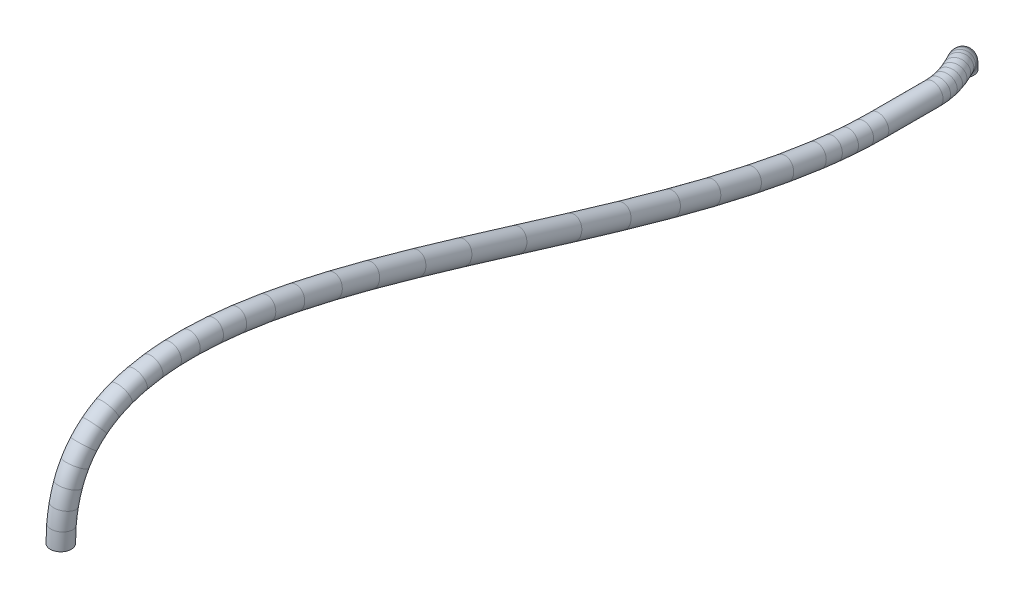
ISO-10303-21;
HEADER;
FILE_DESCRIPTION(('STEP AP214'),'2;1');
FILE_NAME('part.step','',(''),(''),'','','');
FILE_SCHEMA(('AUTOMOTIVE_DESIGN { 1 0 10303 214 1 1 1 1 }'));
ENDSEC;
DATA;
#1=APPLICATION_CONTEXT('core data for automotive mechanical design processes');
#2=APPLICATION_PROTOCOL_DEFINITION('international standard','automotive_design',2000,#1);
#3=PRODUCT_CONTEXT('',#1,'mechanical');
#4=PRODUCT('Part','Part','',(#3));
#5=PRODUCT_RELATED_PRODUCT_CATEGORY('part','',(#4));
#6=PRODUCT_DEFINITION_FORMATION('','',#4);
#7=PRODUCT_DEFINITION_CONTEXT('part definition',#1,'design');
#8=PRODUCT_DEFINITION('design','',#6,#7);
#9=PRODUCT_DEFINITION_SHAPE('','',#8);
#10=(LENGTH_UNIT() NAMED_UNIT(*) SI_UNIT(.MILLI.,.METRE.));
#11=(NAMED_UNIT(*) PLANE_ANGLE_UNIT() SI_UNIT($,.RADIAN.));
#12=(NAMED_UNIT(*) SI_UNIT($,.STERADIAN.) SOLID_ANGLE_UNIT());
#13=UNCERTAINTY_MEASURE_WITH_UNIT(LENGTH_MEASURE(1.E-05),#10,'distance_accuracy_value','');
#14=(GEOMETRIC_REPRESENTATION_CONTEXT(3) GLOBAL_UNCERTAINTY_ASSIGNED_CONTEXT((#13)) GLOBAL_UNIT_ASSIGNED_CONTEXT((#10,
#11,#12)) REPRESENTATION_CONTEXT('',''));
#15=CARTESIAN_POINT('',(0.,0.,0.));
#16=DIRECTION('',(0.,0.,1.));
#17=DIRECTION('',(1.,0.,0.));
#18=AXIS2_PLACEMENT_3D('',#15,#16,#17);
#19=CARTESIAN_POINT('',(-3.74968353162594,128.049999999714,224.960489149716));
#20=DIRECTION('',(0.,1.,0.));
#21=DIRECTION('',(0.,0.,-1.));
#22=AXIS2_PLACEMENT_3D('',#19,#20,#21);
#23=PLANE('',#22);
#24=CARTESIAN_POINT('',(-3.74968353162594,128.049999999714,224.960489149716));
#25=DIRECTION('',(0.,-1.,0.));
#26=DIRECTION('',(0.,0.,-1.));
#27=AXIS2_PLACEMENT_3D('',#24,#25,#26);
#28=CIRCLE('',#27,0.77);
#29=CARTESIAN_POINT('',(-3.74968353162594,128.049999999714,224.190489149716));
#30=VERTEX_POINT('',#29);
#31=EDGE_CURVE('E11',#30,#30,#28,.T.);
#32=ORIENTED_EDGE('',*,*,#31,.T.);
#33=EDGE_LOOP('',(#32));
#34=FACE_BOUND('',#33,.T.);
#35=ADVANCED_FACE('F43',(#34),#23,.F.);
#36=CARTESIAN_POINT('',(-3.57489488065331,128.049999999715,211.014651433645));
#37=DIRECTION('',(-0.999921466294672,0.,-0.0125324077140817));
#38=DIRECTION('',(-0.0125324077140817,0.,0.999921466294672));
#39=AXIS2_PLACEMENT_3D('',#36,#37,#38);
#40=TOROIDAL_SURFACE('',#39,13.9469330203994,0.77);
#41=ORIENTED_EDGE('',*,*,#31,.F.);
#42=EDGE_LOOP('',(#41));
#43=FACE_BOUND('',#42,.T.);
#44=CARTESIAN_POINT('',(-3.74904137688921,129.244421709112,224.909253639303));
#45=DIRECTION('',(-0.00107328111656013,-0.996326107369345,0.0856337307484272));
#46=DIRECTION('',(-4.60391044399756E-05,-0.0856337307484272,-0.996326684395488));
#47=AXIS2_PLACEMENT_3D('',#44,#45,#46);
#48=CIRCLE('',#47,0.77);
#49=CARTESIAN_POINT('',(-3.74907682699963,129.178483736436,224.142082092318));
#50=VERTEX_POINT('',#49);
#51=EDGE_CURVE('E52',#50,#50,#48,.T.);
#52=ORIENTED_EDGE('',*,*,#51,.T.);
#53=EDGE_LOOP('',(#52));
#54=FACE_BOUND('',#53,.T.);
#55=ADVANCED_FACE('F295',(#43,#54),#40,.T.);
#56=CARTESIAN_POINT('',(-3.62396192345315,128.373826335564,214.781671357992));
#57=DIRECTION('',(0.999923726127993,-1.56135381442176E-05,0.0123507765961815));
#58=DIRECTION('',(0.0123507765976869,0.,-0.999923726249874));
#59=AXIS2_PLACEMENT_3D('',#56,#57,#58);
#60=TOROIDAL_SURFACE('',#59,10.1657023386898,0.77);
#61=CARTESIAN_POINT('',(-3.74689794232879,130.426519028251,224.7372147125));
#62=DIRECTION('',(-0.0025092009655732,-0.979401327154709,0.201907761807487));
#63=DIRECTION('',(-0.000256872652281758,-0.201907759491489,-0.979404508195448));
#64=AXIS2_PLACEMENT_3D('',#61,#62,#63);
#65=CIRCLE('',#64,0.77);
#66=CARTESIAN_POINT('',(-3.74709573427105,130.271050053443,223.983073241189));
#67=VERTEX_POINT('',#66);
#68=EDGE_CURVE('E167',#67,#67,#65,.T.);
#69=ORIENTED_EDGE('',*,*,#68,.T.);
#70=EDGE_LOOP('',(#69));
#71=FACE_BOUND('',#70,.T.);
#72=ORIENTED_EDGE('',*,*,#51,.F.);
#73=EDGE_LOOP('',(#72));
#74=FACE_BOUND('',#73,.T.);
#75=ADVANCED_FACE('F168',(#71,#74),#60,.T.);
#76=CARTESIAN_POINT('',(-3.64297806845377,128.677711002938,216.255499449286));
#77=DIRECTION('',(0.999924861807434,-3.46504543539627E-05,0.0122584476476254));
#78=DIRECTION('',(0.0122584476549845,0.,-0.999924862407716));
#79=AXIS2_PLACEMENT_3D('',#76,#77,#78);
#80=TOROIDAL_SURFACE('',#79,8.66075185280262,0.77);
#81=CARTESIAN_POINT('',(-3.74293003548531,131.574581719271,224.416796669273));
#82=DIRECTION('',(-0.00413288953237224,-0.942401928786135,0.334457058296406));
#83=DIRECTION('',(-0.000714986324046932,-0.334457044428597,-0.942410724804553));
#84=AXIS2_PLACEMENT_3D('',#81,#82,#83);
#85=CIRCLE('',#84,0.77);
#86=CARTESIAN_POINT('',(-3.74348057495483,131.317049795061,223.691140411173));
#87=VERTEX_POINT('',#86);
#88=EDGE_CURVE('E171',#87,#87,#85,.T.);
#89=ORIENTED_EDGE('',*,*,#88,.T.);
#90=EDGE_LOOP('',(#89));
#91=FACE_BOUND('',#90,.T.);
#92=ORIENTED_EDGE('',*,*,#68,.F.);
#93=EDGE_LOOP('',(#92));
#94=FACE_BOUND('',#93,.T.);
#95=ADVANCED_FACE('F309',(#91,#94),#80,.T.);
#96=CARTESIAN_POINT('',(-3.66728173386011,129.341525842741,218.125634719291));
#97=DIRECTION('',(0.999927259751701,-0.000104786281678555,0.0120608550811929));
#98=DIRECTION('',(0.012060855147408,0.,-0.999927265241384));
#99=AXIS2_PLACEMENT_3D('',#96,#97,#98);
#100=TOROIDAL_SURFACE('',#99,6.67615008025848,0.77);
#101=CARTESIAN_POINT('',(-3.73682959366278,132.656122237585,223.920424942294));
#102=DIRECTION('',(-0.00607896479311895,-0.868046320935459,0.496445999981325));
#103=DIRECTION('',(-0.00162868645288827,-0.496445919935974,-0.868066124186034));
#104=AXIS2_PLACEMENT_3D('',#101,#102,#103);
#105=CIRCLE('',#104,0.77);
#106=CARTESIAN_POINT('',(-3.7380836822315,132.273858879235,223.252014026671));
#107=VERTEX_POINT('',#106);
#108=EDGE_CURVE('E173',#107,#107,#105,.T.);
#109=ORIENTED_EDGE('',*,*,#108,.T.);
#110=EDGE_LOOP('',(#109));
#111=FACE_BOUND('',#110,.T.);
#112=ORIENTED_EDGE('',*,*,#88,.F.);
#113=EDGE_LOOP('',(#112));
#114=FACE_BOUND('',#113,.T.);
#115=ADVANCED_FACE('F312',(#111,#114),#100,.T.);
#116=CARTESIAN_POINT('',(-3.6737908037922,129.618432694617,218.609732497533));
#117=DIRECTION('',(0.999928443325836,-0.000161505477799532,0.0119616948611179));
#118=DIRECTION('',(0.0119616950171224,0.,-0.999928456366913));
#119=AXIS2_PLACEMENT_3D('',#116,#117,#118);
#120=TOROIDAL_SURFACE('',#119,6.1184136744201,0.77);
#121=CARTESIAN_POINT('',(-3.72911386483873,133.561643425338,223.287660926162));
#122=DIRECTION('',(-0.00783258490682145,-0.764619016978677,0.644434953651833));
#123=DIRECTION('',(-0.00288966355690719,-0.644434724493458,-0.764653866603426));
#124=AXIS2_PLACEMENT_3D('',#121,#122,#123);
#125=CIRCLE('',#124,0.77);
#126=CARTESIAN_POINT('',(-3.73133890577755,133.065428687478,222.698877448877));
#127=VERTEX_POINT('',#126);
#128=EDGE_CURVE('E205',#127,#127,#125,.T.);
#129=ORIENTED_EDGE('',*,*,#128,.T.);
#130=EDGE_LOOP('',(#129));
#131=FACE_BOUND('',#130,.T.);
#132=ORIENTED_EDGE('',*,*,#108,.F.);
#133=EDGE_LOOP('',(#132));
#134=FACE_BOUND('',#133,.T.);
#135=ADVANCED_FACE('F381',(#131,#134),#120,.T.);
#136=CARTESIAN_POINT('',(-3.676303124242,129.698910660878,218.705188687702));
#137=DIRECTION('',(0.999930503616955,-0.000310253225086737,0.011785231405404));
#138=DIRECTION('',(0.0117852319726099,0.,-0.999930551742146));
#139=AXIS2_PLACEMENT_3D('',#136,#137,#138);
#140=TOROIDAL_SURFACE('',#139,5.99354195782575,0.77);
#141=CARTESIAN_POINT('',(-3.71960252022102,134.337006732867,222.501072667689));
#142=DIRECTION('',(-0.00931648116066649,-0.633370134036581,0.773792915765754));
#143=DIRECTION('',(-0.0044764870964178,-0.773792328230094,-0.63342355011124));
#144=AXIS2_PLACEMENT_3D('',#141,#142,#143);
#145=CIRCLE('',#144,0.77);
#146=CARTESIAN_POINT('',(-3.72304941528527,133.74118664013,222.013336534103));
#147=VERTEX_POINT('',#146);
#148=EDGE_CURVE('E186',#147,#147,#145,.T.);
#149=ORIENTED_EDGE('',*,*,#148,.T.);
#150=EDGE_LOOP('',(#149));
#151=FACE_BOUND('',#150,.T.);
#152=ORIENTED_EDGE('',*,*,#128,.F.);
#153=EDGE_LOOP('',(#152));
#154=FACE_BOUND('',#153,.T.);
#155=ADVANCED_FACE('F384',(#151,#154),#140,.T.);
#156=CARTESIAN_POINT('',(-3.67427278205336,129.387492829691,218.450309334562));
#157=DIRECTION('',(0.999931484793308,-0.000416360646926431,0.0116983914647522));
#158=DIRECTION('',(0.0116983924787466,0.,-0.999931571465474));
#159=AXIS2_PLACEMENT_3D('',#156,#157,#158);
#160=TOROIDAL_SURFACE('',#159,6.39596953118865,0.77);
#161=CARTESIAN_POINT('',(-3.7084524315179,134.970619210377,221.570558974054));
#162=DIRECTION('',(-0.0104148005759103,-0.487875323146402,0.87285119063547));
#163=DIRECTION('',(-0.0062196697506987,-0.872850040660919,-0.487948893047647));
#164=AXIS2_PLACEMENT_3D('',#161,#162,#163);
#165=CIRCLE('',#164,0.77);
#166=CARTESIAN_POINT('',(-3.71324157722594,134.298524679068,221.194838326407));
#167=VERTEX_POINT('',#166);
#168=EDGE_CURVE('E184',#167,#167,#165,.T.);
#169=ORIENTED_EDGE('',*,*,#168,.T.);
#170=EDGE_LOOP('',(#169));
#171=FACE_BOUND('',#170,.T.);
#172=ORIENTED_EDGE('',*,*,#148,.F.);
#173=EDGE_LOOP('',(#172));
#174=FACE_BOUND('',#173,.T.);
#175=ADVANCED_FACE('F359',(#171,#174),#160,.T.);
#176=CARTESIAN_POINT('',(-3.66806613831771,127.989365269457,217.668907760488));
#177=DIRECTION('',(0.999933013635121,-0.000673159565455074,0.0115548733781388));
#178=DIRECTION('',(0.0115548759961493,0.,-0.999933240191921));
#179=AXIS2_PLACEMENT_3D('',#176,#177,#178);
#180=TOROIDAL_SURFACE('',#179,7.99765089464495,0.77);
#181=CARTESIAN_POINT('',(-3.69633890299015,135.449911800551,220.550203639215));
#182=DIRECTION('',(-0.011021391598779,-0.360284488203109,0.932777367053602));
#183=DIRECTION('',(-0.00773420938151877,-0.932775406000503,-0.360375115630698));
#184=AXIS2_PLACEMENT_3D('',#181,#182,#183);
#185=CIRCLE('',#184,0.77);
#186=CARTESIAN_POINT('',(-3.70229424421392,134.731674737931,220.272714800179));
#187=VERTEX_POINT('',#186);
#188=EDGE_CURVE('E187',#187,#187,#185,.T.);
#189=ORIENTED_EDGE('',*,*,#188,.T.);
#190=EDGE_LOOP('',(#189));
#191=FACE_BOUND('',#190,.T.);
#192=ORIENTED_EDGE('',*,*,#168,.F.);
#193=EDGE_LOOP('',(#192));
#194=FACE_BOUND('',#193,.T.);
#195=ADVANCED_FACE('F356',(#191,#194),#180,.T.);
#196=CARTESIAN_POINT('',(-3.66499366198673,126.759352754111,217.193852744941));
#197=DIRECTION('',(0.99993360202921,-0.000832261267531237,0.0114934274292904));
#198=DIRECTION('',(0.0114934314098044,0.,-0.999933948335803));
#199=AXIS2_PLACEMENT_3D('',#196,#197,#198);
#200=TOROIDAL_SURFACE('',#199,9.31621652760905,0.77);
#201=CARTESIAN_POINT('',(-3.68322899083849,135.801932792062,219.435125624205));
#202=DIRECTION('',(-0.0113560651723383,-0.240584108696933,0.970561861205304));
#203=DIRECTION('',(-0.00914133689401931,-0.970558910298777,-0.240690335492395));
#204=AXIS2_PLACEMENT_3D('',#201,#202,#203);
#205=CIRCLE('',#204,0.77);
#206=CARTESIAN_POINT('',(-3.69026782024688,135.054602431132,219.249794065876));
#207=VERTEX_POINT('',#206);
#208=EDGE_CURVE('E214',#207,#207,#205,.T.);
#209=ORIENTED_EDGE('',*,*,#208,.T.);
#210=EDGE_LOOP('',(#209));
#211=FACE_BOUND('',#210,.T.);
#212=ORIENTED_EDGE('',*,*,#188,.F.);
#213=EDGE_LOOP('',(#212));
#214=FACE_BOUND('',#213,.T.);
#215=ADVANCED_FACE('F358',(#211,#214),#200,.T.);
#216=CARTESIAN_POINT('',(-3.66317642336996,123.386435817015,216.357791066875));
#217=DIRECTION('',(0.999934288916584,-0.00121053123396785,0.0113996694257865));
#218=DIRECTION('',(0.0113996777782529,0.,-0.999935021562177));
#219=AXIS2_PLACEMENT_3D('',#216,#217,#218);
#220=TOROIDAL_SURFACE('',#219,12.791206167543,0.77);
#221=CARTESIAN_POINT('',(-3.66986690857346,136.031256444592,218.287408063689));
#222=DIRECTION('',(-0.0114518236066517,-0.150851017772034,0.988490175051439));
#223=DIRECTION('',(-0.0101859073416778,-0.988486109490566,-0.150968402773002));
#224=AXIS2_PLACEMENT_3D('',#221,#222,#223);
#225=CIRCLE('',#224,0.77);
#226=CARTESIAN_POINT('',(-3.67771005722656,135.270122140285,218.171162393554));
#227=VERTEX_POINT('',#226);
#228=EDGE_CURVE('E253',#227,#227,#225,.T.);
#229=ORIENTED_EDGE('',*,*,#228,.T.);
#230=EDGE_LOOP('',(#229));
#231=FACE_BOUND('',#230,.T.);
#232=ORIENTED_EDGE('',*,*,#208,.F.);
#233=EDGE_LOOP('',(#232));
#234=FACE_BOUND('',#233,.T.);
#235=ADVANCED_FACE('F396',(#231,#234),#220,.T.);
#236=CARTESIAN_POINT('',(-3.66548148912358,121.04671640111,216.000705623541));
#237=DIRECTION('',(0.99993438386414,-0.00144161136022933,0.0113644059646101));
#238=DIRECTION('',(0.0113644177736289,0.,-0.999935422919233));
#239=AXIS2_PLACEMENT_3D('',#236,#237,#238);
#240=TOROIDAL_SURFACE('',#239,15.1580166115629,0.77);
#241=CARTESIAN_POINT('',(-3.65422136859531,136.176266224485,216.929179073955));
#242=DIRECTION('',(-0.0114313665546635,-0.0612405030805032,0.998057575814712));
#243=DIRECTION('',(-0.0112180134444045,-0.998052125044577,-0.0613686554225046));
#244=AXIS2_PLACEMENT_3D('',#241,#242,#243);
#245=CIRCLE('',#244,0.77);
#246=CARTESIAN_POINT('',(-3.6628592389475,135.4077660882,216.88192520928));
#247=VERTEX_POINT('',#246);
#248=EDGE_CURVE('E249',#247,#247,#245,.T.);
#249=ORIENTED_EDGE('',*,*,#248,.T.);
#250=EDGE_LOOP('',(#249));
#251=FACE_BOUND('',#250,.T.);
#252=ORIENTED_EDGE('',*,*,#228,.F.);
#253=EDGE_LOOP('',(#252));
#254=FACE_BOUND('',#253,.T.);
#255=ADVANCED_FACE('F354',(#251,#254),#240,.T.);
#256=CARTESIAN_POINT('',(-3.68281952873534,114.77656851712,215.61577271225));
#257=DIRECTION('',(0.999933770131024,-0.00203156120989126,0.0113281997954771));
#258=DIRECTION('',(0.0113282231726545,0.,-0.999935833621213));
#259=AXIS2_PLACEMENT_3D('',#256,#257,#258);
#260=TOROIDAL_SURFACE('',#259,21.4399840506549,0.77);
#261=CARTESIAN_POINT('',(-3.63866380234682,136.216442461495,215.56312659716));
#262=DIRECTION('',(-0.0113231530981067,0.00247867876726917,0.999932818921094));
#263=DIRECTION('',(-0.011943611286467,-0.999925926538434,0.00234341325684274));
#264=AXIS2_PLACEMENT_3D('',#261,#262,#263);
#265=CIRCLE('',#264,0.77);
#266=CARTESIAN_POINT('',(-3.6478603830374,135.446499498061,215.564931025368));
#267=VERTEX_POINT('',#266);
#268=EDGE_CURVE('E243',#267,#267,#265,.T.);
#269=ORIENTED_EDGE('',*,*,#268,.T.);
#270=EDGE_LOOP('',(#269));
#271=FACE_BOUND('',#270,.T.);
#272=ORIENTED_EDGE('',*,*,#248,.F.);
#273=EDGE_LOOP('',(#272));
#274=FACE_BOUND('',#273,.T.);
#275=ADVANCED_FACE('F351',(#271,#274),#260,.T.);
#276=CARTESIAN_POINT('',(-3.70077807656531,110.657380501893,215.625780181042));
#277=DIRECTION('',(0.999932937891432,-0.00240229079995971,0.0113291093525691));
#278=DIRECTION('',(0.0113291420428618,0.,-0.999935823210956));
#279=AXIS2_PLACEMENT_3D('',#276,#277,#278);
#280=TOROIDAL_SURFACE('',#279,25.5592142271515,0.77);
#281=CARTESIAN_POINT('',(-3.61965239461575,136.156251354112,213.872373270188));
#282=DIRECTION('',(-0.0111375608198057,0.0686331117157715,0.997579796665508));
#283=DIRECTION('',(-0.0126873957821717,-0.997571066073339,0.0684908615916703));
#284=AXIS2_PLACEMENT_3D('',#281,#282,#283);
#285=CIRCLE('',#284,0.77);
#286=CARTESIAN_POINT('',(-3.62942168936802,135.388121633235,213.925111233614));
#287=VERTEX_POINT('',#286);
#288=EDGE_CURVE('E219',#287,#287,#285,.T.);
#289=ORIENTED_EDGE('',*,*,#288,.T.);
#290=EDGE_LOOP('',(#289));
#291=FACE_BOUND('',#290,.T.);
#292=ORIENTED_EDGE('',*,*,#268,.F.);
#293=EDGE_LOOP('',(#292));
#294=FACE_BOUND('',#293,.T.);
#295=ADVANCED_FACE('F353',(#291,#294),#280,.T.);
#296=CARTESIAN_POINT('',(-3.77324801372848,99.4965880502139,216.392829372891));
#297=DIRECTION('',(0.999929239218928,-0.00340582268664042,0.0113981106716906));
#298=DIRECTION('',(0.0113981767791885,0.,-0.999935038673068));
#299=AXIS2_PLACEMENT_3D('',#296,#297,#298);
#300=TOROIDAL_SURFACE('',#299,36.7465264227112,0.77);
#301=CARTESIAN_POINT('',(-3.60097097834687,136.001245847421,212.187180330605));
#302=DIRECTION('',(-0.0109332901309623,0.114495586102504,0.993363591002789));
#303=DIRECTION('',(-0.0131957632904346,-0.993352983136307,0.114349126474064));
#304=AXIS2_PLACEMENT_3D('',#301,#302,#303);
#305=CIRCLE('',#304,0.77);
#306=CARTESIAN_POINT('',(-3.61113171608051,135.236364050406,212.275229157991));
#307=VERTEX_POINT('',#306);
#308=EDGE_CURVE('E216',#307,#307,#305,.T.);
#309=ORIENTED_EDGE('',*,*,#308,.T.);
#310=EDGE_LOOP('',(#309));
#311=FACE_BOUND('',#310,.T.);
#312=ORIENTED_EDGE('',*,*,#288,.F.);
#313=EDGE_LOOP('',(#312));
#314=FACE_BOUND('',#313,.T.);
#315=ADVANCED_FACE('F291',(#311,#314),#300,.T.);
#316=CARTESIAN_POINT('',(-3.83695933223886,92.2051185638422,217.232546577784));
#317=DIRECTION('',(0.999925902291017,-0.00406610011188762,0.0114741778518016));
#318=DIRECTION('',(0.011474272705245,0.,-0.999934168366041));
#319=AXIS2_PLACEMENT_3D('',#316,#317,#318);
#320=TOROIDAL_SURFACE('',#319,44.0864171385112,0.77);
#321=CARTESIAN_POINT('',(-3.5779174970338,135.705597552396,210.073398499639));
#322=DIRECTION('',(-0.0106613884787951,0.162444361746452,0.986660105675958));
#323=DIRECTION('',(-0.0137186629416297,-0.986647080967109,0.162293979882735));
#324=AXIS2_PLACEMENT_3D('',#321,#322,#323);
#325=CIRCLE('',#324,0.77);
#326=CARTESIAN_POINT('',(-3.58848086749885,134.945879300052,210.198364864149));
#327=VERTEX_POINT('',#326);
#328=EDGE_CURVE('E220',#327,#327,#325,.T.);
#329=ORIENTED_EDGE('',*,*,#328,.T.);
#330=EDGE_LOOP('',(#329));
#331=FACE_BOUND('',#330,.T.);
#332=ORIENTED_EDGE('',*,*,#308,.F.);
#333=EDGE_LOOP('',(#332));
#334=FACE_BOUND('',#333,.T.);
#335=ADVANCED_FACE('F276',(#331,#334),#320,.T.);
#336=CARTESIAN_POINT('',(-4.08426599900101,71.8011531395204,220.589196440206));
#337=DIRECTION('',(0.999912601927666,-0.00598279508960853,0.0117896000424699));
#338=DIRECTION('',(0.011789811045646,0.,-0.999930497762474));
#339=AXIS2_PLACEMENT_3D('',#336,#337,#338);
#340=TOROIDAL_SURFACE('',#339,64.7658583734563,0.77);
#341=CARTESIAN_POINT('',(-3.55543554196876,135.324139513465,207.973057913148));
#342=DIRECTION('',(-0.0103979295285411,0.194875369792719,0.980772895888579));
#343=DIRECTION('',(-0.0140657835414622,-0.980757382188605,0.194723165072674));
#344=AXIS2_PLACEMENT_3D('',#341,#342,#343);
#345=CIRCLE('',#344,0.77);
#346=CARTESIAN_POINT('',(-3.56626619529569,134.56895632918,208.122994750253));
#347=VERTEX_POINT('',#346);
#348=EDGE_CURVE('E182',#347,#347,#345,.T.);
#349=ORIENTED_EDGE('',*,*,#348,.T.);
#350=EDGE_LOOP('',(#349));
#351=FACE_BOUND('',#350,.T.);
#352=ORIENTED_EDGE('',*,*,#328,.F.);
#353=EDGE_LOOP('',(#352));
#354=FACE_BOUND('',#353,.T.);
#355=ADVANCED_FACE('F279',(#351,#354),#340,.T.);
#356=CARTESIAN_POINT('',(-4.31591775887795,57.5750148695578,223.413413207446));
#357=DIRECTION('',(0.999899919531076,-0.00738368115377129,0.0120678156418905));
#358=DIRECTION('',(0.0120681446164382,0.,-0.999927177291185));
#359=AXIS2_PLACEMENT_3D('',#356,#357,#358);
#360=TOROIDAL_SURFACE('',#359,79.2711125676326,0.77);
#361=CARTESIAN_POINT('',(-3.52680457670898,134.730170501625,205.23736997776));
#362=DIRECTION('',(-0.0100526920883623,0.229386802407344,0.973283431618514));
#363=DIRECTION('',(-0.0144269577185918,-0.973264576160402,0.229233347666301));
#364=AXIS2_PLACEMENT_3D('',#361,#362,#363);
#365=CIRCLE('',#364,0.77);
#366=CARTESIAN_POINT('',(-3.5379133341523,133.980756777982,205.413879655463));
#367=VERTEX_POINT('',#366);
#368=EDGE_CURVE('E179',#367,#367,#365,.T.);
#369=ORIENTED_EDGE('',*,*,#368,.T.);
#370=EDGE_LOOP('',(#369));
#371=FACE_BOUND('',#370,.T.);
#372=ORIENTED_EDGE('',*,*,#348,.F.);
#373=EDGE_LOOP('',(#372));
#374=FACE_BOUND('',#373,.T.);
#375=ADVANCED_FACE('F281',(#371,#374),#360,.T.);
#376=CARTESIAN_POINT('',(-5.3916457097763,12.5276460749525,234.019221944709));
#377=DIRECTION('',(0.999839165076537,-0.0121510282503366,0.0131907729687246));
#378=DIRECTION('',(0.0131917468688151,0.,-0.99991298512148));
#379=AXIS2_PLACEMENT_3D('',#376,#377,#378);
#380=TOROIDAL_SURFACE('',#379,125.560063759742,0.77);
#381=CARTESIAN_POINT('',(-3.499124076831,134.057583464795,202.519661769361));
#382=DIRECTION('',(-0.00971902793698738,0.251030915605625,0.967930276366104));
#383=DIRECTION('',(-0.0146474139412622,-0.967907881078682,0.250878032140339));
#384=AXIS2_PLACEMENT_3D('',#381,#382,#383);
#385=CIRCLE('',#384,0.77);
#386=CARTESIAN_POINT('',(-3.51040258556577,133.312294396364,202.712837854109));
#387=VERTEX_POINT('',#386);
#388=EDGE_CURVE('E183',#387,#387,#385,.T.);
#389=ORIENTED_EDGE('',*,*,#388,.T.);
#390=EDGE_LOOP('',(#389));
#391=FACE_BOUND('',#390,.T.);
#392=ORIENTED_EDGE('',*,*,#368,.F.);
#393=EDGE_LOOP('',(#392));
#394=FACE_BOUND('',#393,.T.);
#395=ADVANCED_FACE('F288',(#391,#394),#380,.T.);
#396=CARTESIAN_POINT('',(-6.63767229498544,-23.3288101017454,243.306015711337));
#397=DIRECTION('',(0.999766490161775,-0.0162437742654542,0.0142514892982556));
#398=DIRECTION('',(-0.0162454241122349,-0.999868034390246,0.));
#399=AXIS2_PLACEMENT_3D('',#396,#397,#398);
#400=TOROIDAL_SURFACE('',#399,162.615663552684,0.77);
#401=CARTESIAN_POINT('',(-3.46593820794016,133.145546053802,199.152080425026));
#402=DIRECTION('',(-0.00930270812436144,0.271737825723932,0.962326355085624));
#403=DIRECTION('',(-0.0148514872069349,-0.962299395928268,0.271586645334106));
#404=AXIS2_PLACEMENT_3D('',#401,#402,#403);
#405=CIRCLE('',#404,0.77);
#406=CARTESIAN_POINT('',(-3.4773738530895,132.404575518937,199.361202141933));
#407=VERTEX_POINT('',#406);
#408=EDGE_CURVE('E202',#407,#407,#405,.T.);
#409=ORIENTED_EDGE('',*,*,#408,.T.);
#410=EDGE_LOOP('',(#409));
#411=FACE_BOUND('',#410,.T.);
#412=ORIENTED_EDGE('',*,*,#388,.F.);
#413=EDGE_LOOP('',(#412));
#414=FACE_BOUND('',#413,.T.);
#415=ADVANCED_FACE('F341',(#411,#414),#400,.T.);
#416=CARTESIAN_POINT('',(-16.9990722425859,-186.818386888551,289.371378891754));
#417=DIRECTION('',(0.999129131083776,-0.0366199012053915,0.0199990563649066));
#418=DIRECTION('',(-0.0366272266920443,-0.99932899801059,0.));
#419=AXIS2_PLACEMENT_3D('',#416,#417,#418);
#420=TOROIDAL_SURFACE('',#419,332.71547291427,0.77);
#421=CARTESIAN_POINT('',(-3.43422373253834,132.179814249409,195.799329260406));
#422=DIRECTION('',(-0.00887564310102594,0.281807888255407,0.959429797888606));
#423=DIRECTION('',(-0.014946775507647,-0.959397788967465,0.281660214489489));
#424=AXIS2_PLACEMENT_3D('',#421,#422,#423);
#425=CIRCLE('',#424,0.77);
#426=CARTESIAN_POINT('',(-3.44573274967923,131.441077951904,196.016207625562));
#427=VERTEX_POINT('',#426);
#428=EDGE_CURVE('E223',#427,#427,#425,.T.);
#429=ORIENTED_EDGE('',*,*,#428,.T.);
#430=EDGE_LOOP('',(#429));
#431=FACE_BOUND('',#430,.T.);
#432=ORIENTED_EDGE('',*,*,#408,.F.);
#433=EDGE_LOOP('',(#432));
#434=FACE_BOUND('',#433,.T.);
#435=ADVANCED_FACE('F307',(#431,#434),#420,.T.);
#436=CARTESIAN_POINT('',(-49.3662060078035,-443.679255745309,364.518242226291));
#437=DIRECTION('',(0.997043751117183,-0.0707369243477478,0.0300007648568781));
#438=DIRECTION('',(-0.0707687790914956,-0.997492746793629,0.));
#439=AXIS2_PLACEMENT_3D('',#436,#437,#438);
#440=TOROIDAL_SURFACE('',#439,601.821806752885,0.77);
#441=CARTESIAN_POINT('',(-3.39817440198848,130.985994759763,191.786435614028));
#442=DIRECTION('',(-0.00834446385746464,0.288457883314737,0.957456223268987));
#443=DIRECTION('',(-0.0150065627843381,-0.957417857161314,0.288315538710694));
#444=AXIS2_PLACEMENT_3D('',#441,#442,#443);
#445=CIRCLE('',#444,0.77);
#446=CARTESIAN_POINT('',(-3.40972945533242,130.248783009749,192.008438578835));
#447=VERTEX_POINT('',#446);
#448=EDGE_CURVE('E221',#447,#447,#445,.T.);
#449=ORIENTED_EDGE('',*,*,#448,.T.);
#450=EDGE_LOOP('',(#449));
#451=FACE_BOUND('',#450,.T.);
#452=ORIENTED_EDGE('',*,*,#428,.F.);
#453=EDGE_LOOP('',(#452));
#454=FACE_BOUND('',#453,.T.);
#455=ADVANCED_FACE('F303',(#451,#454),#440,.T.);
#456=CARTESIAN_POINT('',(-126.82287610893,1006.20272826002,-72.9703994149289));
#457=DIRECTION('',(-0.990977551170584,-0.130471344857354,0.0306711794208363));
#458=DIRECTION('',(-0.130532756772493,0.991443997111977,0.));
#459=AXIS2_PLACEMENT_3D('',#456,#457,#458);
#460=TOROIDAL_SURFACE('',#459,922.67771691141,0.77);
#461=CARTESIAN_POINT('',(-3.36450797302752,129.787270950207,187.774968349309));
#462=DIRECTION('',(-0.00773737452209732,0.284150592323877,0.95874844141594));
#463=DIRECTION('',(-0.0149704803120792,-0.958702606388972,0.284016191831061));
#464=AXIS2_PLACEMENT_3D('',#461,#462,#463);
#465=CIRCLE('',#464,0.77);
#466=CARTESIAN_POINT('',(-3.37603524286782,129.049069943287,187.993660817019));
#467=VERTEX_POINT('',#466);
#468=EDGE_CURVE('E224',#467,#467,#465,.T.);
#469=ORIENTED_EDGE('',*,*,#468,.T.);
#470=EDGE_LOOP('',(#469));
#471=FACE_BOUND('',#470,.T.);
#472=ORIENTED_EDGE('',*,*,#448,.F.);
#473=EDGE_LOOP('',(#472));
#474=FACE_BOUND('',#473,.T.);
#475=ADVANCED_FACE('F306',(#471,#474),#460,.T.);
#476=CARTESIAN_POINT('',(-32.1032976753224,537.44212333654,66.7236836376816));
#477=DIRECTION('',(-0.997694178442119,-0.0668434624222363,0.0117591595835997));
#478=DIRECTION('',(-0.0668480843861824,0.997763165091746,0.));
#479=AXIS2_PLACEMENT_3D('',#476,#477,#478);
#480=TOROIDAL_SURFACE('',#479,426.218031338435,0.77);
#481=CARTESIAN_POINT('',(-3.33661388280709,128.737820788068,184.176147298345));
#482=DIRECTION('',(-0.00714402019867262,0.275727216171857,0.961209376378278));
#483=DIRECTION('',(-0.014905257058022,-0.961156479378031,0.275601261720011));
#484=AXIS2_PLACEMENT_3D('',#481,#482,#483);
#485=CIRCLE('',#484,0.77);
#486=CARTESIAN_POINT('',(-3.34809093074177,127.997730298947,184.388360269869));
#487=VERTEX_POINT('',#486);
#488=EDGE_CURVE('E177',#487,#487,#485,.T.);
#489=ORIENTED_EDGE('',*,*,#488,.T.);
#490=EDGE_LOOP('',(#489));
#491=FACE_BOUND('',#490,.T.);
#492=ORIENTED_EDGE('',*,*,#468,.F.);
#493=EDGE_LOOP('',(#492));
#494=FACE_BOUND('',#493,.T.);
#495=ADVANCED_FACE('F418',(#491,#494),#480,.T.);
#496=CARTESIAN_POINT('',(-10.6184575935603,313.474990909698,131.129341334306));
#497=DIRECTION('',(-0.999257547958648,-0.0383608735236172,0.00357718187607984));
#498=DIRECTION('',(-0.0383611189632563,0.999263941384801,0.));
#499=AXIS2_PLACEMENT_3D('',#496,#497,#498);
#500=TOROIDAL_SURFACE('',#499,192.340351708534,0.77);
#501=CARTESIAN_POINT('',(-3.31121754884281,127.739344234701,180.562980614779));
#502=DIRECTION('',(-0.00640483072992393,0.256956359192495,0.966401783738968));
#503=DIRECTION('',(-0.0147734023820943,-0.96634044815675,0.256842139919191));
#504=AXIS2_PLACEMENT_3D('',#501,#502,#503);
#505=CIRCLE('',#504,0.77);
#506=CARTESIAN_POINT('',(-3.32259306867702,126.99526208962,180.760749062517));
#507=VERTEX_POINT('',#506);
#508=EDGE_CURVE('E658',#507,#507,#505,.T.);
#509=ORIENTED_EDGE('',*,*,#508,.T.);
#510=EDGE_LOOP('',(#509));
#511=FACE_BOUND('',#510,.T.);
#512=ORIENTED_EDGE('',*,*,#488,.F.);
#513=EDGE_LOOP('',(#512));
#514=FACE_BOUND('',#513,.T.);
#515=ADVANCED_FACE('F426',(#511,#514),#500,.T.);
#516=CARTESIAN_POINT('',(-8.16448189777563,270.427390931367,142.591522021113));
#517=DIRECTION('',(-0.999439724113133,-0.0333938837881178,0.00225530268720799));
#518=DIRECTION('',(-0.0333939687156036,0.999442265893044,0.));
#519=AXIS2_PLACEMENT_3D('',#516,#517,#518);
#520=TOROIDAL_SURFACE('',#519,147.733762264017,0.77);
#521=CARTESIAN_POINT('',(-3.29270313539486,126.985456335037,177.604972060114));
#522=DIRECTION('',(-0.00572469074171247,0.236945297043338,0.97150612665333));
#523=DIRECTION('',(-0.01464822169155,-0.97143767730412,0.236842286585931));
#524=AXIS2_PLACEMENT_3D('',#521,#522,#523);
#525=CIRCLE('',#524,0.77);
#526=CARTESIAN_POINT('',(-3.30398226609735,126.237449323512,177.787340620785));
#527=VERTEX_POINT('',#526);
#528=EDGE_CURVE('E656',#527,#527,#525,.T.);
#529=ORIENTED_EDGE('',*,*,#528,.T.);
#530=EDGE_LOOP('',(#529));
#531=FACE_BOUND('',#530,.T.);
#532=ORIENTED_EDGE('',*,*,#508,.F.);
#533=EDGE_LOOP('',(#532));
#534=FACE_BOUND('',#533,.T.);
#535=ADVANCED_FACE('F411',(#531,#534),#520,.T.);
#536=CARTESIAN_POINT('',(-5.8668113595481,218.496017738125,155.270853383426));
#537=DIRECTION('',(-0.999610434732199,-0.0278952473699344,0.000913207903480736));
#538=DIRECTION('',(-0.027895259001544,0.999610851544358,0.));
#539=AXIS2_PLACEMENT_3D('',#536,#537,#538);
#540=TOROIDAL_SURFACE('',#539,94.2317448555552,0.77);
#541=CARTESIAN_POINT('',(-3.27658192464598,126.310312221568,174.628233072106));
#542=DIRECTION('',(-0.00483694938135823,0.205368203395856,0.97867282835207));
#543=DIRECTION('',(-0.014477291878937,-0.978596088579749,0.205280548119565));
#544=AXIS2_PLACEMENT_3D('',#541,#542,#543);
#545=CIRCLE('',#544,0.77);
#546=CARTESIAN_POINT('',(-3.28772943939276,125.556793233362,174.786299094159));
#547=VERTEX_POINT('',#546);
#548=EDGE_CURVE('E191',#547,#547,#545,.T.);
#549=ORIENTED_EDGE('',*,*,#548,.T.);
#550=EDGE_LOOP('',(#549));
#551=FACE_BOUND('',#550,.T.);
#552=ORIENTED_EDGE('',*,*,#528,.F.);
#553=EDGE_LOOP('',(#552));
#554=FACE_BOUND('',#553,.T.);
#555=ADVANCED_FACE('F366',(#551,#554),#540,.T.);
#556=CARTESIAN_POINT('',(-5.28251166603379,202.16646082596,158.70039377338));
#557=DIRECTION('',(-0.999653591451659,-0.02631272767812,0.000580913020663511));
#558=DIRECTION('',(-0.0263127321178668,0.99965376012322,0.));
#559=AXIS2_PLACEMENT_3D('',#556,#557,#558);
#560=TOROIDAL_SURFACE('',#559,77.5362824743679,0.77);
#561=CARTESIAN_POINT('',(-3.2658574324187,125.850436193895,172.252979873646));
#562=DIRECTION('',(-0.00402743754319642,0.174744808971003,0.984605520746519));
#563=DIRECTION('',(-0.0143390886815822,-0.98452236798433,0.174671398558292));
#564=AXIS2_PLACEMENT_3D('',#561,#562,#563);
#565=CIRCLE('',#564,0.77);
#566=CARTESIAN_POINT('',(-3.27689853070351,125.092353970547,172.387476850536));
#567=VERTEX_POINT('',#566);
#568=EDGE_CURVE('E188',#567,#567,#565,.T.);
#569=ORIENTED_EDGE('',*,*,#568,.T.);
#570=EDGE_LOOP('',(#569));
#571=FACE_BOUND('',#570,.T.);
#572=ORIENTED_EDGE('',*,*,#548,.F.);
#573=EDGE_LOOP('',(#572));
#574=FACE_BOUND('',#573,.T.);
#575=ADVANCED_FACE('F362',(#571,#574),#560,.T.);
#576=CARTESIAN_POINT('',(-4.54238851103837,178.571198402121,162.89103696775));
#577=DIRECTION('',(-0.999707833394635,-0.0241703880626751,0.000200475195568411));
#578=DIRECTION('',(-0.0241703885483827,0.999707853483917,0.));
#579=AXIS2_PLACEMENT_3D('',#576,#577,#578);
#580=TOROIDAL_SURFACE('',#579,53.5607531162907,0.77);
#581=CARTESIAN_POINT('',(-3.2574192646739,125.481596797094,169.862215479282));
#582=DIRECTION('',(-0.00294717554234745,0.130121384875089,0.991493691031119));
#583=DIRECTION('',(-0.0141816596081029,-0.99140372496342,0.130067423513407));
#584=AXIS2_PLACEMENT_3D('',#581,#582,#583);
#585=CIRCLE('',#584,0.77);
#586=CARTESIAN_POINT('',(-3.26833914257214,124.718215928872,169.962367395387));
#587=VERTEX_POINT('',#586);
#588=EDGE_CURVE('E192',#587,#587,#585,.T.);
#589=ORIENTED_EDGE('',*,*,#588,.T.);
#590=EDGE_LOOP('',(#589));
#591=FACE_BOUND('',#590,.T.);
#592=ORIENTED_EDGE('',*,*,#568,.F.);
#593=EDGE_LOOP('',(#592));
#594=FACE_BOUND('',#593,.T.);
#595=ADVANCED_FACE('F365',(#591,#594),#580,.T.);
#596=CARTESIAN_POINT('',(-4.33750360965809,171.309178611696,163.8446969985));
#597=DIRECTION('',(-0.999722739582014,-0.0235463354448975,0.000118531636324287));
#598=DIRECTION('',(-0.0235463356103075,0.999722746604941,0.));
#599=AXIS2_PLACEMENT_3D('',#596,#597,#598);
#600=TOROIDAL_SURFACE('',#599,46.2335848256747,0.77);
#601=CARTESIAN_POINT('',(-3.25426701286499,125.341803708272,168.679095492243));
#602=DIRECTION('',(-0.00234426512354566,0.104538432882173,0.994518084537214));
#603=DIRECTION('',(-0.0141135266647719,-0.994425220445405,0.104495403282586));
#604=AXIS2_PLACEMENT_3D('',#601,#602,#603);
#605=CIRCLE('',#604,0.77);
#606=CARTESIAN_POINT('',(-3.26513442839687,124.576096288529,168.75955695277));
#607=VERTEX_POINT('',#606);
#608=EDGE_CURVE('E207',#607,#607,#605,.T.);
#609=ORIENTED_EDGE('',*,*,#608,.T.);
#610=EDGE_LOOP('',(#609));
#611=FACE_BOUND('',#610,.T.);
#612=ORIENTED_EDGE('',*,*,#588,.F.);
#613=EDGE_LOOP('',(#612));
#614=FACE_BOUND('',#613,.T.);
#615=ADVANCED_FACE('F390',(#611,#614),#600,.T.);
#616=CARTESIAN_POINT('',(-4.11164894133032,162.871002682256,164.732205395746));
#617=DIRECTION('',(-0.999739242498277,-0.0228351723414741,4.37390662103866E-05));
#618=DIRECTION('',(-0.0228351723633171,0.999739243454581,0.));
#619=AXIS2_PLACEMENT_3D('',#616,#617,#618);
#620=TOROIDAL_SURFACE('',#619,37.7459113128018,0.77);
#621=CARTESIAN_POINT('',(-3.25190164838482,125.235973627363,167.492503108598));
#622=DIRECTION('',(-0.00162628880383441,0.0731103171986259,0.997322533939669));
#623=DIRECTION('',(-0.0140509037136303,-0.997227068550276,0.0730804067822079));
#624=AXIS2_PLACEMENT_3D('',#621,#622,#623);
#625=CIRCLE('',#624,0.77);
#626=CARTESIAN_POINT('',(-3.26272084424432,124.468108784579,167.548775021821));
#627=VERTEX_POINT('',#626);
#628=EDGE_CURVE('E248',#627,#627,#625,.T.);
#629=ORIENTED_EDGE('',*,*,#628,.T.);
#630=EDGE_LOOP('',(#629));
#631=FACE_BOUND('',#630,.T.);
#632=ORIENTED_EDGE('',*,*,#608,.F.);
#633=EDGE_LOOP('',(#632));
#634=FACE_BOUND('',#633,.T.);
#635=ADVANCED_FACE('F45',(#631,#634),#620,.T.);
#636=CARTESIAN_POINT('',(-4.01791548166478,159.221177354019,164.999914502992));
#637=DIRECTION('',(-0.999746114678268,-0.0225323261623295,2.15272384254499E-05));
#638=DIRECTION('',(-0.0225323261675505,0.99974611490992,0.));
#639=AXIS2_PLACEMENT_3D('',#636,#637,#638);
#640=TOROIDAL_SURFACE('',#639,34.0850971465815,0.77);
#641=CARTESIAN_POINT('',(-3.25049659723611,125.172566819459,166.377243952895));
#642=DIRECTION('',(-0.00088899449843079,0.0403987784070292,0.999183240648081));
#643=DIRECTION('',(-0.0140097093485879,-0.9990860778777,0.0403823852059634));
#644=AXIS2_PLACEMENT_3D('',#641,#642,#643);
#645=CIRCLE('',#644,0.77);
#646=CARTESIAN_POINT('',(-3.26128407343452,124.403270539493,166.408338389504));
#647=VERTEX_POINT('',#646);
#648=EDGE_CURVE('E266',#647,#647,#645,.T.);
#649=ORIENTED_EDGE('',*,*,#648,.T.);
#650=EDGE_LOOP('',(#649));
#651=FACE_BOUND('',#650,.T.);
#652=ORIENTED_EDGE('',*,*,#628,.F.);
#653=EDGE_LOOP('',(#652));
#654=FACE_BOUND('',#653,.T.);
#655=ADVANCED_FACE('F314',(#651,#654),#640,.T.);
#656=CARTESIAN_POINT('',(-3.85800924660168,152.779901785578,165.260489149835));
#657=DIRECTION('',(-0.999757967329514,-0.0220001536621363,0.));
#658=DIRECTION('',(-0.0220001536621363,0.999757967329514,0.));
#659=AXIS2_PLACEMENT_3D('',#656,#657,#658);
#660=TOROIDAL_SURFACE('',#659,27.6365909048278,0.77);
#661=CARTESIAN_POINT('',(-3.24999999999787,125.14999983865,165.260489149859));
#662=DIRECTION('',(0.,0.,1.));
#663=DIRECTION('',(-0.0139917521560948,-0.999902110644638,0.));
#664=AXIS2_PLACEMENT_3D('',#661,#662,#663);
#665=CIRCLE('',#664,0.77);
#666=CARTESIAN_POINT('',(-3.26077364915806,124.380075213454,165.26048914986));
#667=VERTEX_POINT('',#666);
#668=EDGE_CURVE('E212',#667,#667,#665,.T.);
#669=ORIENTED_EDGE('',*,*,#668,.T.);
#670=EDGE_LOOP('',(#669));
#671=FACE_BOUND('',#670,.T.);
#672=ORIENTED_EDGE('',*,*,#648,.F.);
#673=EDGE_LOOP('',(#672));
#674=FACE_BOUND('',#673,.T.);
#675=ADVANCED_FACE('F317',(#671,#674),#660,.T.);
#676=CARTESIAN_POINT('',(-4.74999999999876,124.049999838662,157.510489149859));
#677=DIRECTION('',(0.,1.,0.));
#678=DIRECTION('',(1.,0.,0.));
#679=AXIS2_PLACEMENT_3D('',#676,#677,#678);
#680=PLANE('',#679);
#681=CARTESIAN_POINT('',(-4.74999999999876,124.049999838662,157.510489149859));
#682=DIRECTION('',(0.,-1.,0.));
#683=DIRECTION('',(0.,0.,-1.));
#684=AXIS2_PLACEMENT_3D('',#681,#682,#683);
#685=CIRCLE('',#684,0.77);
#686=CARTESIAN_POINT('',(-4.74999999999876,124.049999838662,156.740489149859));
#687=VERTEX_POINT('',#686);
#688=EDGE_CURVE('E263',#687,#687,#685,.T.);
#689=ORIENTED_EDGE('',*,*,#688,.T.);
#690=EDGE_LOOP('',(#689));
#691=FACE_BOUND('',#690,.T.);
#692=ADVANCED_FACE('F333',(#691),#680,.F.);
#693=CARTESIAN_POINT('',(-3.86175228391471,124.049999838662,158.448256961263));
#694=DIRECTION('',(0.726016031521419,0.,-0.687677774814549));
#695=DIRECTION('',(-0.687677774814549,0.,-0.726016031521419));
#696=AXIS2_PLACEMENT_3D('',#693,#694,#695);
#697=TOROIDAL_SURFACE('',#696,1.29166267780515,0.77);
#698=ORIENTED_EDGE('',*,*,#688,.F.);
#699=EDGE_LOOP('',(#698));
#700=FACE_BOUND('',#699,.T.);
#701=CARTESIAN_POINT('',(-4.72594926344536,124.348539037265,157.535880722696));
#702=DIRECTION('',(-0.158941475446666,-0.97292339049372,-0.167802513726828));
#703=DIRECTION('',(0.0135184058559552,0.167802513726828,-0.985727938677844));
#704=AXIS2_PLACEMENT_3D('',#701,#702,#703);
#705=CIRCLE('',#704,0.77);
#706=CARTESIAN_POINT('',(-4.71554009093628,124.477746972834,156.776870209914));
#707=VERTEX_POINT('',#706);
#708=EDGE_CURVE('E231',#707,#707,#705,.T.);
#709=ORIENTED_EDGE('',*,*,#708,.T.);
#710=EDGE_LOOP('',(#709));
#711=FACE_BOUND('',#710,.T.);
#712=ADVANCED_FACE('F330',(#700,#711),#697,.T.);
#713=CARTESIAN_POINT('',(-4.201900151941,124.150318435409,158.188792997968));
#714=DIRECTION('',(-0.776998296788141,0.0184087433886088,0.629233474121634));
#715=DIRECTION('',(0.629340119124034,0.,0.77712998556287));
#716=AXIS2_PLACEMENT_3D('',#713,#714,#715);
#717=TOROIDAL_SURFACE('',#716,0.860356506030778,0.77);
#718=CARTESIAN_POINT('',(-4.64784280395366,124.622251043349,157.624321491027));
#719=DIRECTION('',(-0.357232151337544,-0.835927244836923,-0.416666331001319));
#720=DIRECTION('',(0.084191923306648,0.415466924127213,-0.905703569058994));
#721=AXIS2_PLACEMENT_3D('',#718,#719,#720);
#722=CIRCLE('',#721,0.77);
#723=CARTESIAN_POINT('',(-4.58301502300754,124.942160574927,156.926929742852));
#724=VERTEX_POINT('',#723);
#725=EDGE_CURVE('E227',#724,#724,#722,.T.);
#726=ORIENTED_EDGE('',*,*,#725,.T.);
#727=EDGE_LOOP('',(#726));
#728=FACE_BOUND('',#727,.T.);
#729=ORIENTED_EDGE('',*,*,#708,.F.);
#730=EDGE_LOOP('',(#729));
#731=FACE_BOUND('',#730,.T.);
#732=ADVANCED_FACE('F329',(#728,#731),#717,.T.);
#733=CARTESIAN_POINT('',(-4.24336841160888,124.156927523669,158.211086804746));
#734=DIRECTION('',(-0.804083139085622,0.0482660297882527,0.592554382151286));
#735=DIRECTION('',(0.593245800635383,0.,0.8050213786158));
#736=AXIS2_PLACEMENT_3D('',#733,#734,#735);
#737=TOROIDAL_SURFACE('',#736,0.851128101647424,0.77);
#738=CARTESIAN_POINT('',(-4.52217383450134,124.834246876814,157.777583545896));
#739=DIRECTION('',(-0.496132170010669,-0.603645955630134,-0.624070853454868));
#740=DIRECTION('',(0.204012937248203,0.61759761580004,-0.759573502956408));
#741=AXIS2_PLACEMENT_3D('',#738,#739,#740);
#742=CIRCLE('',#741,0.77);
#743=CARTESIAN_POINT('',(-4.36508387282022,125.30979704098,157.192711948619));
#744=VERTEX_POINT('',#743);
#745=EDGE_CURVE('E225',#744,#744,#742,.T.);
#746=ORIENTED_EDGE('',*,*,#745,.T.);
#747=EDGE_LOOP('',(#746));
#748=FACE_BOUND('',#747,.T.);
#749=ORIENTED_EDGE('',*,*,#725,.F.);
#750=EDGE_LOOP('',(#749));
#751=FACE_BOUND('',#750,.T.);
#752=ADVANCED_FACE('F325',(#748,#751),#737,.T.);
#753=CARTESIAN_POINT('',(-4.24304862619485,123.862119773045,158.495991715039));
#754=DIRECTION('',(-0.838588239240287,0.146891530422881,0.524588070106345));
#755=DIRECTION('',(0.53034088656787,0.,0.847784491503829));
#756=AXIS2_PLACEMENT_3D('',#753,#754,#755);
#757=TOROIDAL_SURFACE('',#756,1.24058546069468,0.77);
#758=CARTESIAN_POINT('',(-4.37032355666766,124.982550588909,157.978799135603));
#759=DIRECTION('',(-0.535018239313047,-0.403421239845574,-0.742298313916869));
#760=DIRECTION('',(0.311470939535653,0.722545863908721,-0.617181762832618));
#761=AXIS2_PLACEMENT_3D('',#758,#759,#760);
#762=CIRCLE('',#761,0.77);
#763=CARTESIAN_POINT('',(-4.13049093322521,125.538910904118,157.503569178222));
#764=VERTEX_POINT('',#763);
#765=EDGE_CURVE('E228',#764,#764,#762,.T.);
#766=ORIENTED_EDGE('',*,*,#765,.T.);
#767=EDGE_LOOP('',(#766));
#768=FACE_BOUND('',#767,.T.);
#769=ORIENTED_EDGE('',*,*,#745,.F.);
#770=EDGE_LOOP('',(#769));
#771=FACE_BOUND('',#770,.T.);
#772=ADVANCED_FACE('F328',(#768,#771),#757,.T.);
#773=CARTESIAN_POINT('',(-4.32566571322322,123.469946802128,158.768675285519));
#774=DIRECTION('',(-0.844435349327056,0.228147262564158,0.484641896033942));
#775=DIRECTION('',(0.497769759011145,0.,0.867309210728208));
#776=AXIS2_PLACEMENT_3D('',#773,#774,#775);
#777=TOROIDAL_SURFACE('',#776,1.7070058204271,0.77);
#778=CARTESIAN_POINT('',(-4.1961189925859,125.085782498508,158.233734615493));
#779=DIRECTION('',(-0.530254152764125,-0.227848691899352,-0.816648949718393));
#780=DIRECTION('',(0.405124343813568,0.778043949249089,-0.48012694059645));
#781=AXIS2_PLACEMENT_3D('',#778,#779,#780);
#782=CIRCLE('',#781,0.77);
#783=CARTESIAN_POINT('',(-3.88417324784945,125.684876339429,157.864036871234));
#784=VERTEX_POINT('',#783);
#785=EDGE_CURVE('E233',#784,#784,#782,.T.);
#786=ORIENTED_EDGE('',*,*,#785,.T.);
#787=EDGE_LOOP('',(#786));
#788=FACE_BOUND('',#787,.T.);
#789=ORIENTED_EDGE('',*,*,#765,.F.);
#790=EDGE_LOOP('',(#789));
#791=FACE_BOUND('',#790,.T.);
#792=ADVANCED_FACE('F388',(#788,#791),#777,.T.);
#793=CARTESIAN_POINT('',(-5.04199104760994,122.49785768767,159.505006014452));
#794=DIRECTION('',(-0.799741083278303,0.454228300550862,0.392544074844498));
#795=DIRECTION('',(0.493869638720116,0.869535956674859,0.));
#796=AXIS2_PLACEMENT_3D('',#793,#794,#795);
#797=TOROIDAL_SURFACE('',#796,3.00482700497504,0.77);
#798=CARTESIAN_POINT('',(-4.02820148643522,125.144798202833,158.507548263632));
#799=DIRECTION('',(-0.496572465652509,-0.133036230080497,-0.85773955711612));
#800=DIRECTION('',(0.460295521026175,0.797434219842825,-0.390162399965587));
#801=AXIS2_PLACEMENT_3D('',#798,#799,#800);
#802=CIRCLE('',#801,0.77);
#803=CARTESIAN_POINT('',(-3.67377393524505,125.758822552112,158.207123215659));
#804=VERTEX_POINT('',#803);
#805=EDGE_CURVE('E209',#804,#804,#802,.T.);
#806=ORIENTED_EDGE('',*,*,#805,.T.);
#807=EDGE_LOOP('',(#806));
#808=FACE_BOUND('',#807,.T.);
#809=ORIENTED_EDGE('',*,*,#785,.F.);
#810=EDGE_LOOP('',(#809));
#811=FACE_BOUND('',#810,.T.);
#812=ADVANCED_FACE('F339',(#808,#811),#797,.T.);
#813=CARTESIAN_POINT('',(-5.8426737771527,122.105454486202,160.029408598056));
#814=DIRECTION('',(-0.729144278414986,0.60005964233623,0.329054777953465));
#815=DIRECTION('',(0.635447164316053,0.772144352671628,0.));
#816=AXIS2_PLACEMENT_3D('',#813,#814,#815);
#817=TOROIDAL_SURFACE('',#816,3.85304798816482,0.77);
#818=CARTESIAN_POINT('',(-3.80460530631777,125.184930362601,158.929825025076));
#819=DIRECTION('',(-0.434235955893005,-0.0340299168744012,-0.900156152768624));
#820=DIRECTION('',(0.518320406605952,0.807848816269911,-0.280578413544494));
#821=AXIS2_PLACEMENT_3D('',#818,#819,#820);
#822=CIRCLE('',#821,0.77);
#823=CARTESIAN_POINT('',(-3.40549859323119,125.806973951129,158.713779646647));
#824=VERTEX_POINT('',#823);
#825=EDGE_CURVE('E200',#824,#824,#822,.T.);
#826=ORIENTED_EDGE('',*,*,#825,.T.);
#827=EDGE_LOOP('',(#826));
#828=FACE_BOUND('',#827,.T.);
#829=ORIENTED_EDGE('',*,*,#805,.F.);
#830=EDGE_LOOP('',(#829));
#831=FACE_BOUND('',#830,.T.);
#832=ADVANCED_FACE('F335',(#828,#831),#817,.T.);
#833=CARTESIAN_POINT('',(-8.07521179788921,122.823683825503,161.079234224283));
#834=DIRECTION('',(-0.412323178673136,0.895965142507441,0.165033510962176));
#835=DIRECTION('',(0.908421453717025,0.418055573371108,0.));
#836=AXIS2_PLACEMENT_3D('',#833,#834,#835);
#837=TOROIDAL_SURFACE('',#836,5.33230952969184,0.77);
#838=CARTESIAN_POINT('',(-3.61370477794605,125.191681759223,159.370121642462));
#839=DIRECTION('',(-0.360463754061412,0.00592453139888537,-0.932754406012461));
#840=DIRECTION('',(0.550037994770014,0.808970541911134,-0.207424363635008));
#841=AXIS2_PLACEMENT_3D('',#838,#839,#840);
#842=CIRCLE('',#841,0.77);
#843=CARTESIAN_POINT('',(-3.19017552197314,125.814589076495,159.210404882464));
#844=VERTEX_POINT('',#843);
#845=EDGE_CURVE('E197',#844,#844,#842,.T.);
#846=ORIENTED_EDGE('',*,*,#845,.T.);
#847=EDGE_LOOP('',(#846));
#848=FACE_BOUND('',#847,.T.);
#849=ORIENTED_EDGE('',*,*,#825,.F.);
#850=EDGE_LOOP('',(#849));
#851=FACE_BOUND('',#850,.T.);
#852=ADVANCED_FACE('F338',(#848,#851),#837,.T.);
#853=CARTESIAN_POINT('',(-8.53765067057277,123.637146179251,161.263110959917));
#854=DIRECTION('',(-0.261617859458861,0.959200363225329,0.107194956973545));
#855=DIRECTION('',(0.964759286557982,0.263134032386792,0.));
#856=AXIS2_PLACEMENT_3D('',#853,#854,#855);
#857=TOROIDAL_SURFACE('',#856,5.49956658100534,0.77);
#858=CARTESIAN_POINT('',(-3.46504652179608,125.183498710688,159.806157433807));
#859=DIRECTION('',(-0.284253590078627,0.0295646062731395,-0.958293186130073));
#860=DIRECTION('',(0.571460853216138,0.807791298356388,-0.144588075376862));
#861=AXIS2_PLACEMENT_3D('',#858,#859,#860);
#862=CIRCLE('',#861,0.77);
#863=CARTESIAN_POINT('',(-3.02502166481966,125.805498010422,159.694824615767));
#864=VERTEX_POINT('',#863);
#865=EDGE_CURVE('E195',#864,#864,#862,.T.);
#866=ORIENTED_EDGE('',*,*,#865,.T.);
#867=EDGE_LOOP('',(#866));
#868=FACE_BOUND('',#867,.T.);
#869=ORIENTED_EDGE('',*,*,#845,.F.);
#870=EDGE_LOOP('',(#869));
#871=FACE_BOUND('',#870,.T.);
#872=ADVANCED_FACE('F373',(#868,#871),#857,.T.);
#873=CARTESIAN_POINT('',(-8.57783359877921,125.092199110628,161.319920514053));
#874=DIRECTION('',(-0.00801393926489541,0.999416251323507,0.033210440646396));
#875=DIRECTION('',(0.,0.0332115071385266,-0.99944834573558));
#876=AXIS2_PLACEMENT_3D('',#873,#874,#875);
#877=TOROIDAL_SURFACE('',#876,5.33295471335098,0.77);
#878=CARTESIAN_POINT('',(-3.35328539994272,125.169549482996,160.252906450144));
#879=DIRECTION('',(-0.200444236500486,0.030931926263523,-0.979216688987358));
#880=DIRECTION('',(0.584092276345199,0.806214734034443,-0.0940957774804782));
#881=AXIS2_PLACEMENT_3D('',#878,#879,#880);
#882=CIRCLE('',#881,0.77);
#883=CARTESIAN_POINT('',(-2.90353434715692,125.790334828203,160.180452701484));
#884=VERTEX_POINT('',#883);
#885=EDGE_CURVE('E193',#884,#884,#882,.T.);
#886=ORIENTED_EDGE('',*,*,#885,.T.);
#887=EDGE_LOOP('',(#886));
#888=FACE_BOUND('',#887,.T.);
#889=ORIENTED_EDGE('',*,*,#865,.F.);
#890=EDGE_LOOP('',(#889));
#891=FACE_BOUND('',#890,.T.);
#892=ADVANCED_FACE('F323',(#888,#891),#877,.T.);
#893=CARTESIAN_POINT('',(-8.36568638646984,125.573003597572,161.291682150286));
#894=DIRECTION('',(0.0831973535975006,0.996428389506455,0.0144452393523143));
#895=DIRECTION('',(0.996532365613892,-0.0832060351415707,0.));
#896=AXIS2_PLACEMENT_3D('',#893,#894,#895);
#897=TOROIDAL_SURFACE('',#896,5.13478274394471,0.77);
#898=CARTESIAN_POINT('',(-3.27619367938436,125.155847447744,160.754059086516));
#899=DIRECTION('',(-0.103154697984803,0.0230287749983754,-0.994398704648059));
#900=DIRECTION('',(0.591987347719201,0.804811489360439,-0.0427720321450568));
#901=AXIS2_PLACEMENT_3D('',#898,#899,#900);
#902=CIRCLE('',#901,0.77);
#903=CARTESIAN_POINT('',(-2.82036342164057,125.775552294552,160.721124621764));
#904=VERTEX_POINT('',#903);
#905=EDGE_CURVE('E196',#904,#904,#902,.T.);
#906=ORIENTED_EDGE('',*,*,#905,.T.);
#907=EDGE_LOOP('',(#906));
#908=FACE_BOUND('',#907,.T.);
#909=ORIENTED_EDGE('',*,*,#885,.F.);
#910=EDGE_LOOP('',(#909));
#911=FACE_BOUND('',#910,.T.);
#912=ADVANCED_FACE('F319',(#908,#911),#897,.T.);
#913=CARTESIAN_POINT('',(-7.92636104487159,126.193974261704,161.260489149857));
#914=DIRECTION('',(0.217881626271472,0.975975203031972,0.));
#915=DIRECTION('',(0.975975203031972,-0.217881626271472,0.));
#916=AXIS2_PLACEMENT_3D('',#913,#914,#915);
#917=TOROIDAL_SURFACE('',#916,4.79147526529762,0.77);
#918=CARTESIAN_POINT('',(-3.24999999999875,125.149999838662,161.260489149859));
#919=DIRECTION('',(0.,0.,1.));
#920=DIRECTION('',(-1.,0.,0.));
#921=AXIS2_PLACEMENT_3D('',#918,#919,#920);
#922=CIRCLE('',#921,0.77);
#923=CARTESIAN_POINT('',(-4.01999999999875,125.149999838662,161.260489149859));
#924=VERTEX_POINT('',#923);
#925=EDGE_CURVE('E210',#924,#924,#922,.T.);
#926=ORIENTED_EDGE('',*,*,#925,.F.);
#927=EDGE_LOOP('',(#926));
#928=FACE_BOUND('',#927,.T.);
#929=ORIENTED_EDGE('',*,*,#905,.F.);
#930=EDGE_LOOP('',(#929));
#931=FACE_BOUND('',#930,.T.);
#932=ADVANCED_FACE('F322',(#928,#931),#917,.T.);
#933=CARTESIAN_POINT('',(-3.24999999999875,125.149999838662,161.260489149859));
#934=DIRECTION('',(0.,0.,1.));
#935=DIRECTION('',(1.,0.,0.));
#936=AXIS2_PLACEMENT_3D('',#933,#934,#935);
#937=CYLINDRICAL_SURFACE('',#936,0.77);
#938=ORIENTED_EDGE('',*,*,#668,.F.);
#939=EDGE_LOOP('',(#938));
#940=FACE_BOUND('',#939,.T.);
#941=ORIENTED_EDGE('',*,*,#925,.T.);
#942=EDGE_LOOP('',(#941));
#943=FACE_BOUND('',#942,.T.);
#944=ADVANCED_FACE('F405',(#940,#943),#937,.T.);
#945=CLOSED_SHELL('',(#35,#55,#75,#95,#115,#135,#155,#175,#195,#215,#235,#255,#275,#295,#315,
#335,#355,#375,#395,#415,#435,#455,#475,#495,#515,#535,#555,#575,#595,#615,#635,#655,#675,#692,
#712,#732,#752,#772,#792,#812,#832,#852,#872,#892,#912,#932,#944));
#946=MANIFOLD_SOLID_BREP('B2',#945);
#947=ADVANCED_BREP_SHAPE_REPRESENTATION('',(#18,#946),#14);
#948=SHAPE_DEFINITION_REPRESENTATION(#9,#947);
ENDSEC;
END-ISO-10303-21;
